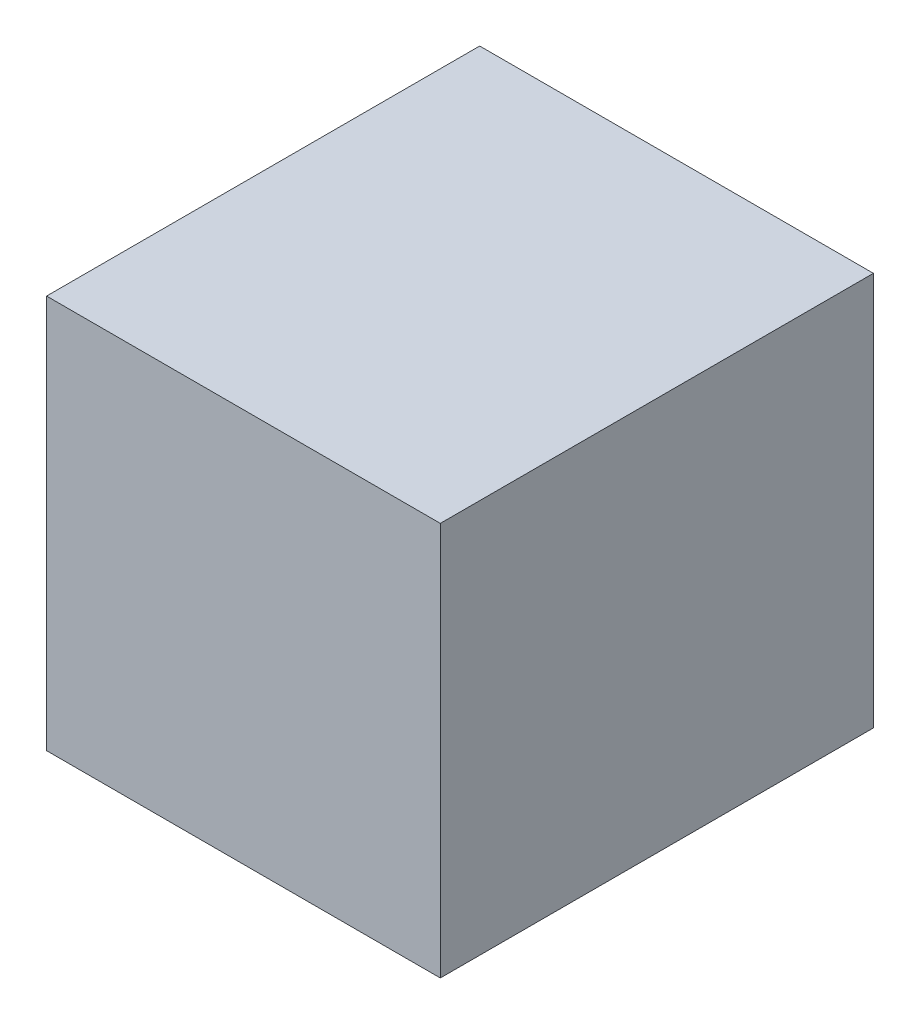
ISO-10303-21;
HEADER;
FILE_DESCRIPTION(('STEP AP214'),'2;1');
FILE_NAME('part.step','',(''),(''),'','','');
FILE_SCHEMA(('AUTOMOTIVE_DESIGN { 1 0 10303 214 1 1 1 1 }'));
ENDSEC;
DATA;
#1=APPLICATION_CONTEXT('core data for automotive mechanical design processes');
#2=APPLICATION_PROTOCOL_DEFINITION('international standard','automotive_design',2000,#1);
#3=PRODUCT_CONTEXT('',#1,'mechanical');
#4=PRODUCT('Part','Part','',(#3));
#5=PRODUCT_RELATED_PRODUCT_CATEGORY('part','',(#4));
#6=PRODUCT_DEFINITION_FORMATION('','',#4);
#7=PRODUCT_DEFINITION_CONTEXT('part definition',#1,'design');
#8=PRODUCT_DEFINITION('design','',#6,#7);
#9=PRODUCT_DEFINITION_SHAPE('','',#8);
#10=(LENGTH_UNIT() NAMED_UNIT(*) SI_UNIT(.MILLI.,.METRE.));
#11=(NAMED_UNIT(*) PLANE_ANGLE_UNIT() SI_UNIT($,.RADIAN.));
#12=(NAMED_UNIT(*) SI_UNIT($,.STERADIAN.) SOLID_ANGLE_UNIT());
#13=UNCERTAINTY_MEASURE_WITH_UNIT(LENGTH_MEASURE(1.E-05),#10,'distance_accuracy_value','');
#14=(GEOMETRIC_REPRESENTATION_CONTEXT(3) GLOBAL_UNCERTAINTY_ASSIGNED_CONTEXT((#13)) GLOBAL_UNIT_ASSIGNED_CONTEXT((#10,
#11,#12)) REPRESENTATION_CONTEXT('',''));
#15=CARTESIAN_POINT('',(0.,0.,0.));
#16=DIRECTION('',(0.,0.,1.));
#17=DIRECTION('',(1.,0.,0.));
#18=AXIS2_PLACEMENT_3D('',#15,#16,#17);
#19=CARTESIAN_POINT('',(0.,0.,0.));
#20=DIRECTION('',(0.,0.,-1.));
#21=DIRECTION('',(-1.,0.,0.));
#22=AXIS2_PLACEMENT_3D('',#19,#20,#21);
#23=PLANE('',#22);
#24=CARTESIAN_POINT('',(0.,0.,0.));
#25=DIRECTION('',(0.,0.,-1.));
#26=DIRECTION('',(-1.,0.,0.));
#27=AXIS2_PLACEMENT_3D('',#24,#25,#26);
#28=CIRCLE('',#27,4.);
#29=CARTESIAN_POINT('',(-4.,0.,0.));
#30=VERTEX_POINT('',#29);
#31=EDGE_CURVE('E49',#30,#30,#28,.T.);
#32=ORIENTED_EDGE('',*,*,#31,.T.);
#33=EDGE_LOOP('',(#32));
#34=FACE_BOUND('',#33,.T.);
#35=CARTESIAN_POINT('',(0.,0.,0.));
#36=DIRECTION('',(0.,0.,-1.));
#37=DIRECTION('',(-1.,0.,0.));
#38=AXIS2_PLACEMENT_3D('',#35,#36,#37);
#39=CIRCLE('',#38,3.8);
#40=CARTESIAN_POINT('',(-3.8,0.,0.));
#41=VERTEX_POINT('',#40);
#42=EDGE_CURVE('E115',#41,#41,#39,.F.);
#43=ORIENTED_EDGE('',*,*,#42,.T.);
#44=EDGE_LOOP('',(#43));
#45=FACE_BOUND('',#44,.T.);
#46=ADVANCED_FACE('F45',(#34,#45),#23,.T.);
#47=CARTESIAN_POINT('',(0.,0.,0.400000000000011));
#48=DIRECTION('',(0.,0.,-1.));
#49=DIRECTION('',(-1.,0.,0.));
#50=AXIS2_PLACEMENT_3D('',#47,#48,#49);
#51=CONICAL_SURFACE('',#50,3.4,0.785398163397434);
#52=ORIENTED_EDGE('',*,*,#42,.F.);
#53=EDGE_LOOP('',(#52));
#54=FACE_BOUND('',#53,.T.);
#55=CARTESIAN_POINT('',(0.,0.,0.400000000000011));
#56=DIRECTION('',(0.,0.,-1.));
#57=DIRECTION('',(-1.,0.,0.));
#58=AXIS2_PLACEMENT_3D('',#55,#56,#57);
#59=CIRCLE('',#58,3.4);
#60=CARTESIAN_POINT('',(-3.4,0.,0.400000000000011));
#61=VERTEX_POINT('',#60);
#62=EDGE_CURVE('E122',#61,#61,#59,.T.);
#63=ORIENTED_EDGE('',*,*,#62,.F.);
#64=EDGE_LOOP('',(#63));
#65=FACE_BOUND('',#64,.T.);
#66=ADVANCED_FACE('F146',(#54,#65),#51,.F.);
#67=CARTESIAN_POINT('',(0.,0.,-200.));
#68=DIRECTION('',(0.,0.,-1.));
#69=DIRECTION('',(-1.,0.,0.));
#70=AXIS2_PLACEMENT_3D('',#67,#68,#69);
#71=CYLINDRICAL_SURFACE('',#70,3.4);
#72=ORIENTED_EDGE('',*,*,#62,.T.);
#73=EDGE_LOOP('',(#72));
#74=FACE_BOUND('',#73,.T.);
#75=CARTESIAN_POINT('',(0.,0.,36.));
#76=DIRECTION('',(0.,0.,-1.));
#77=DIRECTION('',(-1.,0.,0.));
#78=AXIS2_PLACEMENT_3D('',#75,#76,#77);
#79=CIRCLE('',#78,3.4);
#80=CARTESIAN_POINT('',(-3.4,0.,36.));
#81=VERTEX_POINT('',#80);
#82=EDGE_CURVE('E129',#81,#81,#79,.T.);
#83=ORIENTED_EDGE('',*,*,#82,.F.);
#84=EDGE_LOOP('',(#83));
#85=FACE_BOUND('',#84,.T.);
#86=ADVANCED_FACE('F143',(#74,#85),#71,.F.);
#87=CARTESIAN_POINT('',(3.4,0.,36.));
#88=DIRECTION('',(0.,0.,-1.));
#89=DIRECTION('',(-1.,0.,0.));
#90=AXIS2_PLACEMENT_3D('',#87,#88,#89);
#91=PLANE('',#90);
#92=ORIENTED_EDGE('',*,*,#82,.T.);
#93=EDGE_LOOP('',(#92));
#94=FACE_BOUND('',#93,.T.);
#95=ADVANCED_FACE('F155',(#94),#91,.T.);
#96=CARTESIAN_POINT('',(0.,0.,-200.));
#97=DIRECTION('',(0.,0.,-1.));
#98=DIRECTION('',(-1.,0.,0.));
#99=AXIS2_PLACEMENT_3D('',#96,#97,#98);
#100=CYLINDRICAL_SURFACE('',#99,4.);
#101=ORIENTED_EDGE('',*,*,#31,.F.);
#102=EDGE_LOOP('',(#101));
#103=FACE_BOUND('',#102,.T.);
#104=CARTESIAN_POINT('',(0.,0.,0.299999999999995));
#105=DIRECTION('',(0.,0.,-1.));
#106=DIRECTION('',(-1.,0.,0.));
#107=AXIS2_PLACEMENT_3D('',#104,#105,#106);
#108=CIRCLE('',#107,4.);
#109=CARTESIAN_POINT('',(-4.,0.,0.299999999999995));
#110=VERTEX_POINT('',#109);
#111=EDGE_CURVE('E131',#110,#110,#108,.T.);
#112=ORIENTED_EDGE('',*,*,#111,.T.);
#113=EDGE_LOOP('',(#112));
#114=FACE_BOUND('',#113,.T.);
#115=ADVANCED_FACE('F214',(#103,#114),#100,.T.);
#116=CARTESIAN_POINT('',(0.,0.,-200.));
#117=DIRECTION('',(0.,0.,-1.));
#118=DIRECTION('',(-1.,0.,0.));
#119=AXIS2_PLACEMENT_3D('',#116,#117,#118);
#120=CYLINDRICAL_SURFACE('',#119,7.5);
#121=CARTESIAN_POINT('',(0.,0.,0.));
#122=DIRECTION('',(0.,0.,-1.));
#123=DIRECTION('',(-1.,0.,0.));
#124=AXIS2_PLACEMENT_3D('',#121,#122,#123);
#125=CIRCLE('',#124,7.5);
#126=CARTESIAN_POINT('',(-7.5,0.,0.));
#127=VERTEX_POINT('',#126);
#128=EDGE_CURVE('E123',#127,#127,#125,.F.);
#129=ORIENTED_EDGE('',*,*,#128,.F.);
#130=EDGE_LOOP('',(#129));
#131=FACE_BOUND('',#130,.T.);
#132=CARTESIAN_POINT('',(0.,0.,0.299999999999995));
#133=DIRECTION('',(0.,0.,-1.));
#134=DIRECTION('',(-1.,0.,0.));
#135=AXIS2_PLACEMENT_3D('',#132,#133,#134);
#136=CIRCLE('',#135,7.5);
#137=CARTESIAN_POINT('',(-7.5,0.,0.299999999999995));
#138=VERTEX_POINT('',#137);
#139=EDGE_CURVE('E125',#138,#138,#136,.T.);
#140=ORIENTED_EDGE('',*,*,#139,.F.);
#141=EDGE_LOOP('',(#140));
#142=FACE_BOUND('',#141,.T.);
#143=ADVANCED_FACE('F232',(#131,#142),#120,.F.);
#144=CARTESIAN_POINT('',(7.5,0.,0.3));
#145=DIRECTION('',(0.,0.,-1.));
#146=DIRECTION('',(-1.,0.,0.));
#147=AXIS2_PLACEMENT_3D('',#144,#145,#146);
#148=PLANE('',#147);
#149=ORIENTED_EDGE('',*,*,#139,.T.);
#150=EDGE_LOOP('',(#149));
#151=FACE_BOUND('',#150,.T.);
#152=ORIENTED_EDGE('',*,*,#111,.F.);
#153=EDGE_LOOP('',(#152));
#154=FACE_BOUND('',#153,.T.);
#155=ADVANCED_FACE('F164',(#151,#154),#148,.T.);
#156=CARTESIAN_POINT('',(0.,0.,44.));
#157=DIRECTION('',(0.,0.,-1.));
#158=DIRECTION('',(-1.,0.,0.));
#159=AXIS2_PLACEMENT_3D('',#156,#157,#158);
#160=PLANE('',#159);
#161=DIRECTION('',(-1.,0.,0.));
#162=VECTOR('',#161,1.);
#163=CARTESIAN_POINT('',(20.,20.,44.));
#164=LINE('',#163,#162);
#165=CARTESIAN_POINT('',(20.,20.,44.));
#166=VERTEX_POINT('',#165);
#167=CARTESIAN_POINT('',(-20.,20.,44.));
#168=VERTEX_POINT('',#167);
#169=EDGE_CURVE('E99',#166,#168,#164,.T.);
#170=ORIENTED_EDGE('',*,*,#169,.T.);
#171=DIRECTION('',(0.,-1.,0.));
#172=VECTOR('',#171,1.);
#173=CARTESIAN_POINT('',(-20.,-20.,44.));
#174=LINE('',#173,#172);
#175=CARTESIAN_POINT('',(-20.,-20.,44.));
#176=VERTEX_POINT('',#175);
#177=EDGE_CURVE('E94',#168,#176,#174,.T.);
#178=ORIENTED_EDGE('',*,*,#177,.T.);
#179=DIRECTION('',(1.,0.,0.));
#180=VECTOR('',#179,1.);
#181=CARTESIAN_POINT('',(20.,-20.,44.));
#182=LINE('',#181,#180);
#183=CARTESIAN_POINT('',(20.,-20.,44.));
#184=VERTEX_POINT('',#183);
#185=EDGE_CURVE('E97',#176,#184,#182,.T.);
#186=ORIENTED_EDGE('',*,*,#185,.T.);
#187=DIRECTION('',(0.,1.,0.));
#188=VECTOR('',#187,1.);
#189=CARTESIAN_POINT('',(20.,-20.,44.));
#190=LINE('',#189,#188);
#191=EDGE_CURVE('E64',#184,#166,#190,.T.);
#192=ORIENTED_EDGE('',*,*,#191,.T.);
#193=EDGE_LOOP('',(#170,#178,#186,#192));
#194=FACE_BOUND('',#193,.T.);
#195=ADVANCED_FACE('F95',(#194),#160,.F.);
#196=CARTESIAN_POINT('',(-20.,-20.,44.));
#197=DIRECTION('',(1.,0.,0.));
#198=DIRECTION('',(0.,0.,-1.));
#199=AXIS2_PLACEMENT_3D('',#196,#197,#198);
#200=PLANE('',#199);
#201=DIRECTION('',(0.,-1.,0.));
#202=VECTOR('',#201,1.);
#203=CARTESIAN_POINT('',(-20.,-20.,0.));
#204=LINE('',#203,#202);
#205=CARTESIAN_POINT('',(-20.,20.,0.));
#206=VERTEX_POINT('',#205);
#207=CARTESIAN_POINT('',(-20.,-20.,0.));
#208=VERTEX_POINT('',#207);
#209=EDGE_CURVE('E103',#206,#208,#204,.T.);
#210=ORIENTED_EDGE('',*,*,#209,.T.);
#211=DIRECTION('',(0.,0.,-1.));
#212=VECTOR('',#211,1.);
#213=CARTESIAN_POINT('',(-20.,-20.,44.));
#214=LINE('',#213,#212);
#215=EDGE_CURVE('E55',#176,#208,#214,.T.);
#216=ORIENTED_EDGE('',*,*,#215,.F.);
#217=ORIENTED_EDGE('',*,*,#177,.F.);
#218=DIRECTION('',(0.,0.,-1.));
#219=VECTOR('',#218,1.);
#220=CARTESIAN_POINT('',(-20.,20.,44.));
#221=LINE('',#220,#219);
#222=EDGE_CURVE('E11',#168,#206,#221,.T.);
#223=ORIENTED_EDGE('',*,*,#222,.T.);
#224=EDGE_LOOP('',(#210,#216,#217,#223));
#225=FACE_BOUND('',#224,.T.);
#226=ADVANCED_FACE('F102',(#225),#200,.F.);
#227=CARTESIAN_POINT('',(20.,-20.,44.));
#228=DIRECTION('',(0.,1.,0.));
#229=DIRECTION('',(0.,0.,1.));
#230=AXIS2_PLACEMENT_3D('',#227,#228,#229);
#231=PLANE('',#230);
#232=DIRECTION('',(1.,0.,0.));
#233=VECTOR('',#232,1.);
#234=CARTESIAN_POINT('',(20.,-20.,0.));
#235=LINE('',#234,#233);
#236=CARTESIAN_POINT('',(20.,-20.,0.));
#237=VERTEX_POINT('',#236);
#238=EDGE_CURVE('E81',#208,#237,#235,.T.);
#239=ORIENTED_EDGE('',*,*,#238,.T.);
#240=DIRECTION('',(0.,0.,-1.));
#241=VECTOR('',#240,1.);
#242=CARTESIAN_POINT('',(20.,-20.,44.));
#243=LINE('',#242,#241);
#244=EDGE_CURVE('E104',#184,#237,#243,.T.);
#245=ORIENTED_EDGE('',*,*,#244,.F.);
#246=ORIENTED_EDGE('',*,*,#185,.F.);
#247=ORIENTED_EDGE('',*,*,#215,.T.);
#248=EDGE_LOOP('',(#239,#245,#246,#247));
#249=FACE_BOUND('',#248,.T.);
#250=ADVANCED_FACE('F106',(#249),#231,.F.);
#251=CARTESIAN_POINT('',(20.,-20.,44.));
#252=DIRECTION('',(-1.,0.,0.));
#253=DIRECTION('',(0.,0.,1.));
#254=AXIS2_PLACEMENT_3D('',#251,#252,#253);
#255=PLANE('',#254);
#256=DIRECTION('',(0.,1.,0.));
#257=VECTOR('',#256,1.);
#258=CARTESIAN_POINT('',(20.,-20.,0.));
#259=LINE('',#258,#257);
#260=CARTESIAN_POINT('',(20.,20.,0.));
#261=VERTEX_POINT('',#260);
#262=EDGE_CURVE('E87',#237,#261,#259,.T.);
#263=ORIENTED_EDGE('',*,*,#262,.T.);
#264=DIRECTION('',(0.,0.,-1.));
#265=VECTOR('',#264,1.);
#266=CARTESIAN_POINT('',(20.,20.,44.));
#267=LINE('',#266,#265);
#268=EDGE_CURVE('E108',#166,#261,#267,.T.);
#269=ORIENTED_EDGE('',*,*,#268,.F.);
#270=ORIENTED_EDGE('',*,*,#191,.F.);
#271=ORIENTED_EDGE('',*,*,#244,.T.);
#272=EDGE_LOOP('',(#263,#269,#270,#271));
#273=FACE_BOUND('',#272,.T.);
#274=ADVANCED_FACE('F167',(#273),#255,.F.);
#275=CARTESIAN_POINT('',(20.,20.,44.));
#276=DIRECTION('',(0.,-1.,0.));
#277=DIRECTION('',(0.,0.,-1.));
#278=AXIS2_PLACEMENT_3D('',#275,#276,#277);
#279=PLANE('',#278);
#280=DIRECTION('',(-1.,0.,0.));
#281=VECTOR('',#280,1.);
#282=CARTESIAN_POINT('',(20.,20.,0.));
#283=LINE('',#282,#281);
#284=EDGE_CURVE('E112',#261,#206,#283,.T.);
#285=ORIENTED_EDGE('',*,*,#284,.T.);
#286=ORIENTED_EDGE('',*,*,#222,.F.);
#287=ORIENTED_EDGE('',*,*,#169,.F.);
#288=ORIENTED_EDGE('',*,*,#268,.T.);
#289=EDGE_LOOP('',(#285,#286,#287,#288));
#290=FACE_BOUND('',#289,.T.);
#291=ADVANCED_FACE('F47',(#290),#279,.F.);
#292=ORIENTED_EDGE('',*,*,#128,.T.);
#293=EDGE_LOOP('',(#292));
#294=FACE_BOUND('',#293,.T.);
#295=ORIENTED_EDGE('',*,*,#284,.F.);
#296=ORIENTED_EDGE('',*,*,#262,.F.);
#297=ORIENTED_EDGE('',*,*,#238,.F.);
#298=ORIENTED_EDGE('',*,*,#209,.F.);
#299=EDGE_LOOP('',(#295,#296,#297,#298));
#300=FACE_BOUND('',#299,.T.);
#301=ADVANCED_FACE('F159',(#294,#300),#23,.T.);
#302=CLOSED_SHELL('',(#46,#66,#86,#95,#115,#143,#155,#195,#226,#250,#274,#291,#301));
#303=MANIFOLD_SOLID_BREP('B2',#302);
#304=ADVANCED_BREP_SHAPE_REPRESENTATION('',(#18,#303),#14);
#305=SHAPE_DEFINITION_REPRESENTATION(#9,#304);
ENDSEC;
END-ISO-10303-21;
